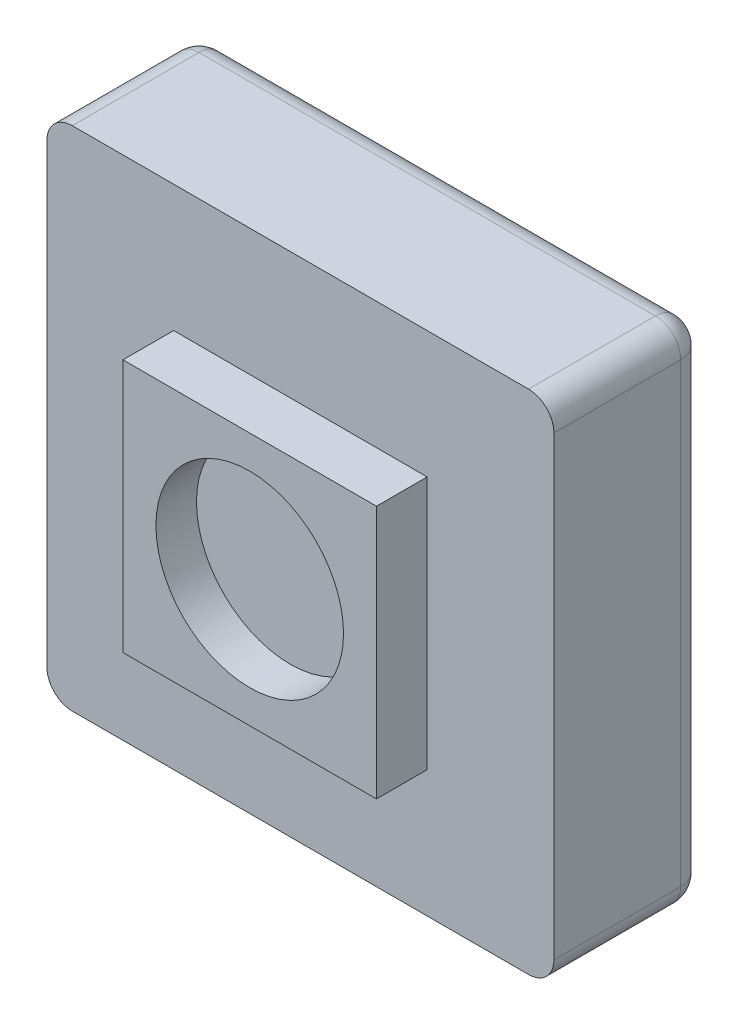
ISO-10303-21;
HEADER;
FILE_DESCRIPTION(('STEP AP214'),'2;1');
FILE_NAME('part.step','',(''),(''),'','','');
FILE_SCHEMA(('AUTOMOTIVE_DESIGN { 1 0 10303 214 1 1 1 1 }'));
ENDSEC;
DATA;
#1=APPLICATION_CONTEXT('core data for automotive mechanical design processes');
#2=APPLICATION_PROTOCOL_DEFINITION('international standard','automotive_design',2000,#1);
#3=PRODUCT_CONTEXT('',#1,'mechanical');
#4=PRODUCT('Part','Part','',(#3));
#5=PRODUCT_RELATED_PRODUCT_CATEGORY('part','',(#4));
#6=PRODUCT_DEFINITION_FORMATION('','',#4);
#7=PRODUCT_DEFINITION_CONTEXT('part definition',#1,'design');
#8=PRODUCT_DEFINITION('design','',#6,#7);
#9=PRODUCT_DEFINITION_SHAPE('','',#8);
#10=(LENGTH_UNIT() NAMED_UNIT(*) SI_UNIT(.MILLI.,.METRE.));
#11=(NAMED_UNIT(*) PLANE_ANGLE_UNIT() SI_UNIT($,.RADIAN.));
#12=(NAMED_UNIT(*) SI_UNIT($,.STERADIAN.) SOLID_ANGLE_UNIT());
#13=UNCERTAINTY_MEASURE_WITH_UNIT(LENGTH_MEASURE(1.E-05),#10,'distance_accuracy_value','');
#14=(GEOMETRIC_REPRESENTATION_CONTEXT(3) GLOBAL_UNCERTAINTY_ASSIGNED_CONTEXT((#13)) GLOBAL_UNIT_ASSIGNED_CONTEXT((#10,
#11,#12)) REPRESENTATION_CONTEXT('',''));
#15=CARTESIAN_POINT('',(0.,0.,0.));
#16=DIRECTION('',(0.,0.,1.));
#17=DIRECTION('',(1.,0.,0.));
#18=AXIS2_PLACEMENT_3D('',#15,#16,#17);
#19=CARTESIAN_POINT('',(4.99999999999998,5.00000000000002,3.));
#20=DIRECTION('',(-1.,0.,0.));
#21=DIRECTION('',(0.,-1.,0.));
#22=AXIS2_PLACEMENT_3D('',#19,#20,#21);
#23=PLANE('',#22);
#24=DIRECTION('',(0.,0.,-1.));
#25=VECTOR('',#24,1.);
#26=CARTESIAN_POINT('',(4.99999999999998,-4.49999999999999,3.));
#27=LINE('',#26,#25);
#28=CARTESIAN_POINT('',(4.99999999999998,-4.49999999999999,3.));
#29=VERTEX_POINT('',#28);
#30=CARTESIAN_POINT('',(4.99999999999998,-4.49999999999999,0.5));
#31=VERTEX_POINT('',#30);
#32=EDGE_CURVE('E226',#29,#31,#27,.T.);
#33=ORIENTED_EDGE('',*,*,#32,.T.);
#34=DIRECTION('',(0.,1.,0.));
#35=VECTOR('',#34,1.);
#36=CARTESIAN_POINT('',(4.99999999999998,5.00000000000002,0.5));
#37=LINE('',#36,#35);
#38=CARTESIAN_POINT('',(4.99999999999998,4.50000000000002,0.5));
#39=VERTEX_POINT('',#38);
#40=EDGE_CURVE('E237',#31,#39,#37,.T.);
#41=ORIENTED_EDGE('',*,*,#40,.T.);
#42=DIRECTION('',(0.,0.,-1.));
#43=VECTOR('',#42,1.);
#44=CARTESIAN_POINT('',(4.99999999999998,4.50000000000002,3.));
#45=LINE('',#44,#43);
#46=CARTESIAN_POINT('',(4.99999999999998,4.50000000000002,3.));
#47=VERTEX_POINT('',#46);
#48=EDGE_CURVE('E230',#39,#47,#45,.F.);
#49=ORIENTED_EDGE('',*,*,#48,.T.);
#50=DIRECTION('',(0.,1.,0.));
#51=VECTOR('',#50,1.);
#52=CARTESIAN_POINT('',(4.99999999999998,5.00000000000002,3.));
#53=LINE('',#52,#51);
#54=EDGE_CURVE('E173',#29,#47,#53,.T.);
#55=ORIENTED_EDGE('',*,*,#54,.F.);
#56=EDGE_LOOP('',(#33,#41,#49,#55));
#57=FACE_BOUND('',#56,.T.);
#58=ADVANCED_FACE('F41',(#57),#23,.F.);
#59=CARTESIAN_POINT('',(-5.00000000000002,5.00000000000002,3.));
#60=DIRECTION('',(0.,-1.,0.));
#61=DIRECTION('',(0.,0.,-1.));
#62=AXIS2_PLACEMENT_3D('',#59,#60,#61);
#63=PLANE('',#62);
#64=DIRECTION('',(0.,0.,-1.));
#65=VECTOR('',#64,1.);
#66=CARTESIAN_POINT('',(4.49999999999998,5.00000000000002,3.));
#67=LINE('',#66,#65);
#68=CARTESIAN_POINT('',(4.49999999999998,5.00000000000002,3.));
#69=VERTEX_POINT('',#68);
#70=CARTESIAN_POINT('',(4.49999999999998,5.00000000000002,0.5));
#71=VERTEX_POINT('',#70);
#72=EDGE_CURVE('E219',#69,#71,#67,.T.);
#73=ORIENTED_EDGE('',*,*,#72,.T.);
#74=DIRECTION('',(-1.,0.,0.));
#75=VECTOR('',#74,1.);
#76=CARTESIAN_POINT('',(-5.00000000000002,5.00000000000002,0.5));
#77=LINE('',#76,#75);
#78=CARTESIAN_POINT('',(-4.50000000000002,5.00000000000002,0.5));
#79=VERTEX_POINT('',#78);
#80=EDGE_CURVE('E256',#71,#79,#77,.T.);
#81=ORIENTED_EDGE('',*,*,#80,.T.);
#82=DIRECTION('',(0.,0.,-1.));
#83=VECTOR('',#82,1.);
#84=CARTESIAN_POINT('',(-4.50000000000002,5.00000000000002,3.));
#85=LINE('',#84,#83);
#86=CARTESIAN_POINT('',(-4.50000000000002,5.00000000000002,3.));
#87=VERTEX_POINT('',#86);
#88=EDGE_CURVE('E223',#79,#87,#85,.F.);
#89=ORIENTED_EDGE('',*,*,#88,.T.);
#90=DIRECTION('',(-1.,0.,0.));
#91=VECTOR('',#90,1.);
#92=CARTESIAN_POINT('',(-5.00000000000002,5.00000000000002,3.));
#93=LINE('',#92,#91);
#94=EDGE_CURVE('E178',#69,#87,#93,.T.);
#95=ORIENTED_EDGE('',*,*,#94,.F.);
#96=EDGE_LOOP('',(#73,#81,#89,#95));
#97=FACE_BOUND('',#96,.T.);
#98=ADVANCED_FACE('F382',(#97),#63,.F.);
#99=CARTESIAN_POINT('',(-5.00000000000002,5.00000000000002,3.));
#100=DIRECTION('',(1.,0.,0.));
#101=DIRECTION('',(0.,1.,0.));
#102=AXIS2_PLACEMENT_3D('',#99,#100,#101);
#103=PLANE('',#102);
#104=DIRECTION('',(0.,0.,-1.));
#105=VECTOR('',#104,1.);
#106=CARTESIAN_POINT('',(-5.00000000000002,4.50000000000002,3.));
#107=LINE('',#106,#105);
#108=CARTESIAN_POINT('',(-5.00000000000002,4.50000000000002,3.));
#109=VERTEX_POINT('',#108);
#110=CARTESIAN_POINT('',(-5.00000000000002,4.50000000000002,0.5));
#111=VERTEX_POINT('',#110);
#112=EDGE_CURVE('E201',#109,#111,#107,.T.);
#113=ORIENTED_EDGE('',*,*,#112,.T.);
#114=DIRECTION('',(0.,-1.,0.));
#115=VECTOR('',#114,1.);
#116=CARTESIAN_POINT('',(-5.00000000000002,5.00000000000002,0.5));
#117=LINE('',#116,#115);
#118=CARTESIAN_POINT('',(-5.00000000000002,-4.49999999999999,0.5));
#119=VERTEX_POINT('',#118);
#120=EDGE_CURVE('E66',#111,#119,#117,.T.);
#121=ORIENTED_EDGE('',*,*,#120,.T.);
#122=DIRECTION('',(0.,0.,-1.));
#123=VECTOR('',#122,1.);
#124=CARTESIAN_POINT('',(-5.00000000000002,-4.49999999999999,3.));
#125=LINE('',#124,#123);
#126=CARTESIAN_POINT('',(-5.00000000000002,-4.49999999999999,3.));
#127=VERTEX_POINT('',#126);
#128=EDGE_CURVE('E204',#119,#127,#125,.F.);
#129=ORIENTED_EDGE('',*,*,#128,.T.);
#130=DIRECTION('',(0.,-1.,0.));
#131=VECTOR('',#130,1.);
#132=CARTESIAN_POINT('',(-5.00000000000002,5.00000000000002,3.));
#133=LINE('',#132,#131);
#134=EDGE_CURVE('E187',#109,#127,#133,.T.);
#135=ORIENTED_EDGE('',*,*,#134,.F.);
#136=EDGE_LOOP('',(#113,#121,#129,#135));
#137=FACE_BOUND('',#136,.T.);
#138=ADVANCED_FACE('F402',(#137),#103,.F.);
#139=CARTESIAN_POINT('',(-5.00000000000002,-4.99999999999999,3.));
#140=DIRECTION('',(0.,1.,0.));
#141=DIRECTION('',(0.,0.,1.));
#142=AXIS2_PLACEMENT_3D('',#139,#140,#141);
#143=PLANE('',#142);
#144=DIRECTION('',(0.,0.,-1.));
#145=VECTOR('',#144,1.);
#146=CARTESIAN_POINT('',(-4.50000000000002,-4.99999999999999,3.));
#147=LINE('',#146,#145);
#148=CARTESIAN_POINT('',(-4.50000000000002,-4.99999999999999,3.));
#149=VERTEX_POINT('',#148);
#150=CARTESIAN_POINT('',(-4.50000000000002,-4.99999999999999,0.5));
#151=VERTEX_POINT('',#150);
#152=EDGE_CURVE('E198',#149,#151,#147,.T.);
#153=ORIENTED_EDGE('',*,*,#152,.T.);
#154=DIRECTION('',(1.,0.,0.));
#155=VECTOR('',#154,1.);
#156=CARTESIAN_POINT('',(-5.00000000000002,-4.99999999999999,0.5));
#157=LINE('',#156,#155);
#158=CARTESIAN_POINT('',(4.49999999999998,-4.99999999999999,0.5));
#159=VERTEX_POINT('',#158);
#160=EDGE_CURVE('E11',#151,#159,#157,.T.);
#161=ORIENTED_EDGE('',*,*,#160,.T.);
#162=DIRECTION('',(0.,0.,-1.));
#163=VECTOR('',#162,1.);
#164=CARTESIAN_POINT('',(4.49999999999998,-4.99999999999999,3.));
#165=LINE('',#164,#163);
#166=CARTESIAN_POINT('',(4.49999999999998,-4.99999999999999,3.));
#167=VERTEX_POINT('',#166);
#168=EDGE_CURVE('E195',#159,#167,#165,.F.);
#169=ORIENTED_EDGE('',*,*,#168,.T.);
#170=DIRECTION('',(1.,0.,0.));
#171=VECTOR('',#170,1.);
#172=CARTESIAN_POINT('',(-5.00000000000002,-4.99999999999999,3.));
#173=LINE('',#172,#171);
#174=EDGE_CURVE('E191',#149,#167,#173,.T.);
#175=ORIENTED_EDGE('',*,*,#174,.F.);
#176=EDGE_LOOP('',(#153,#161,#169,#175));
#177=FACE_BOUND('',#176,.T.);
#178=ADVANCED_FACE('F340',(#177),#143,.F.);
#179=CARTESIAN_POINT('',(0.,0.,3.));
#180=DIRECTION('',(0.,0.,1.));
#181=DIRECTION('',(1.,0.,0.));
#182=AXIS2_PLACEMENT_3D('',#179,#180,#181);
#183=PLANE('',#182);
#184=DIRECTION('',(0.,1.,0.));
#185=VECTOR('',#184,1.);
#186=CARTESIAN_POINT('',(2.5,2.5,3.));
#187=LINE('',#186,#185);
#188=CARTESIAN_POINT('',(2.5,-2.5,3.));
#189=VERTEX_POINT('',#188);
#190=CARTESIAN_POINT('',(2.5,2.5,3.));
#191=VERTEX_POINT('',#190);
#192=EDGE_CURVE('E171',#189,#191,#187,.T.);
#193=ORIENTED_EDGE('',*,*,#192,.F.);
#194=DIRECTION('',(1.,0.,0.));
#195=VECTOR('',#194,1.);
#196=CARTESIAN_POINT('',(-2.5,-2.5,3.));
#197=LINE('',#196,#195);
#198=CARTESIAN_POINT('',(-2.5,-2.5,3.));
#199=VERTEX_POINT('',#198);
#200=EDGE_CURVE('E168',#199,#189,#197,.T.);
#201=ORIENTED_EDGE('',*,*,#200,.F.);
#202=DIRECTION('',(0.,-1.,0.));
#203=VECTOR('',#202,1.);
#204=CARTESIAN_POINT('',(-2.5,2.5,3.));
#205=LINE('',#204,#203);
#206=CARTESIAN_POINT('',(-2.5,2.5,3.));
#207=VERTEX_POINT('',#206);
#208=EDGE_CURVE('E320',#207,#199,#205,.T.);
#209=ORIENTED_EDGE('',*,*,#208,.F.);
#210=DIRECTION('',(-1.,0.,0.));
#211=VECTOR('',#210,1.);
#212=CARTESIAN_POINT('',(-2.5,2.5,3.));
#213=LINE('',#212,#211);
#214=EDGE_CURVE('E317',#191,#207,#213,.T.);
#215=ORIENTED_EDGE('',*,*,#214,.F.);
#216=EDGE_LOOP('',(#193,#201,#209,#215));
#217=FACE_BOUND('',#216,.T.);
#218=ORIENTED_EDGE('',*,*,#134,.T.);
#219=CARTESIAN_POINT('',(-4.50000000000002,-4.49999999999999,3.));
#220=DIRECTION('',(0.,0.,1.));
#221=DIRECTION('',(1.,0.,0.));
#222=AXIS2_PLACEMENT_3D('',#219,#220,#221);
#223=CIRCLE('',#222,0.5);
#224=EDGE_CURVE('E216',#127,#149,#223,.T.);
#225=ORIENTED_EDGE('',*,*,#224,.T.);
#226=ORIENTED_EDGE('',*,*,#174,.T.);
#227=CARTESIAN_POINT('',(4.49999999999998,-4.49999999999999,3.));
#228=DIRECTION('',(0.,0.,1.));
#229=DIRECTION('',(1.,0.,0.));
#230=AXIS2_PLACEMENT_3D('',#227,#228,#229);
#231=CIRCLE('',#230,0.5);
#232=EDGE_CURVE('E207',#167,#29,#231,.T.);
#233=ORIENTED_EDGE('',*,*,#232,.T.);
#234=ORIENTED_EDGE('',*,*,#54,.T.);
#235=CARTESIAN_POINT('',(4.49999999999998,4.50000000000002,3.));
#236=DIRECTION('',(0.,0.,1.));
#237=DIRECTION('',(1.,0.,0.));
#238=AXIS2_PLACEMENT_3D('',#235,#236,#237);
#239=CIRCLE('',#238,0.5);
#240=EDGE_CURVE('E210',#47,#69,#239,.T.);
#241=ORIENTED_EDGE('',*,*,#240,.T.);
#242=ORIENTED_EDGE('',*,*,#94,.T.);
#243=CARTESIAN_POINT('',(-4.50000000000002,4.50000000000002,3.));
#244=DIRECTION('',(0.,0.,1.));
#245=DIRECTION('',(1.,0.,0.));
#246=AXIS2_PLACEMENT_3D('',#243,#244,#245);
#247=CIRCLE('',#246,0.5);
#248=EDGE_CURVE('E213',#87,#109,#247,.T.);
#249=ORIENTED_EDGE('',*,*,#248,.T.);
#250=EDGE_LOOP('',(#218,#225,#226,#233,#234,#241,#242,#249));
#251=FACE_BOUND('',#250,.T.);
#252=ADVANCED_FACE('F336',(#217,#251),#183,.T.);
#253=CARTESIAN_POINT('',(0.,0.,0.));
#254=DIRECTION('',(0.,0.,1.));
#255=DIRECTION('',(1.,0.,0.));
#256=AXIS2_PLACEMENT_3D('',#253,#254,#255);
#257=PLANE('',#256);
#258=DIRECTION('',(-1.,0.,0.));
#259=VECTOR('',#258,1.);
#260=CARTESIAN_POINT('',(0.,4.50000000000002,0.));
#261=LINE('',#260,#259);
#262=CARTESIAN_POINT('',(-4.50000000000002,4.50000000000002,0.));
#263=VERTEX_POINT('',#262);
#264=CARTESIAN_POINT('',(4.49999999999998,4.50000000000002,0.));
#265=VERTEX_POINT('',#264);
#266=EDGE_CURVE('E246',#263,#265,#261,.F.);
#267=ORIENTED_EDGE('',*,*,#266,.T.);
#268=DIRECTION('',(0.,1.,0.));
#269=VECTOR('',#268,1.);
#270=CARTESIAN_POINT('',(4.49999999999998,0.,0.));
#271=LINE('',#270,#269);
#272=CARTESIAN_POINT('',(4.49999999999998,-4.49999999999999,0.));
#273=VERTEX_POINT('',#272);
#274=EDGE_CURVE('E249',#265,#273,#271,.F.);
#275=ORIENTED_EDGE('',*,*,#274,.T.);
#276=DIRECTION('',(1.,0.,0.));
#277=VECTOR('',#276,1.);
#278=CARTESIAN_POINT('',(0.,-4.49999999999999,0.));
#279=LINE('',#278,#277);
#280=CARTESIAN_POINT('',(-4.50000000000002,-4.49999999999999,0.));
#281=VERTEX_POINT('',#280);
#282=EDGE_CURVE('E240',#273,#281,#279,.F.);
#283=ORIENTED_EDGE('',*,*,#282,.T.);
#284=DIRECTION('',(0.,-1.,0.));
#285=VECTOR('',#284,1.);
#286=CARTESIAN_POINT('',(-4.50000000000002,0.,0.));
#287=LINE('',#286,#285);
#288=EDGE_CURVE('E243',#281,#263,#287,.F.);
#289=ORIENTED_EDGE('',*,*,#288,.T.);
#290=EDGE_LOOP('',(#267,#275,#283,#289));
#291=FACE_BOUND('',#290,.T.);
#292=ADVANCED_FACE('F339',(#291),#257,.F.);
#293=CARTESIAN_POINT('',(2.5,2.5,4.));
#294=DIRECTION('',(-1.,0.,0.));
#295=DIRECTION('',(0.,-1.,0.));
#296=AXIS2_PLACEMENT_3D('',#293,#294,#295);
#297=PLANE('',#296);
#298=ORIENTED_EDGE('',*,*,#192,.T.);
#299=DIRECTION('',(0.,0.,-1.));
#300=VECTOR('',#299,1.);
#301=CARTESIAN_POINT('',(2.5,2.5,4.));
#302=LINE('',#301,#300);
#303=CARTESIAN_POINT('',(2.5,2.5,4.));
#304=VERTEX_POINT('',#303);
#305=EDGE_CURVE('E150',#304,#191,#302,.T.);
#306=ORIENTED_EDGE('',*,*,#305,.F.);
#307=DIRECTION('',(0.,1.,0.));
#308=VECTOR('',#307,1.);
#309=CARTESIAN_POINT('',(2.5,2.5,4.));
#310=LINE('',#309,#308);
#311=CARTESIAN_POINT('',(2.5,-2.5,4.));
#312=VERTEX_POINT('',#311);
#313=EDGE_CURVE('E158',#312,#304,#310,.T.);
#314=ORIENTED_EDGE('',*,*,#313,.F.);
#315=DIRECTION('',(0.,0.,-1.));
#316=VECTOR('',#315,1.);
#317=CARTESIAN_POINT('',(2.5,-2.5,4.));
#318=LINE('',#317,#316);
#319=EDGE_CURVE('E314',#312,#189,#318,.T.);
#320=ORIENTED_EDGE('',*,*,#319,.T.);
#321=EDGE_LOOP('',(#298,#306,#314,#320));
#322=FACE_BOUND('',#321,.T.);
#323=ADVANCED_FACE('F170',(#322),#297,.F.);
#324=CARTESIAN_POINT('',(-2.5,2.5,4.));
#325=DIRECTION('',(0.,-1.,0.));
#326=DIRECTION('',(0.,0.,-1.));
#327=AXIS2_PLACEMENT_3D('',#324,#325,#326);
#328=PLANE('',#327);
#329=ORIENTED_EDGE('',*,*,#214,.T.);
#330=DIRECTION('',(0.,0.,-1.));
#331=VECTOR('',#330,1.);
#332=CARTESIAN_POINT('',(-2.5,2.5,4.));
#333=LINE('',#332,#331);
#334=CARTESIAN_POINT('',(-2.5,2.5,4.));
#335=VERTEX_POINT('',#334);
#336=EDGE_CURVE('E153',#335,#207,#333,.T.);
#337=ORIENTED_EDGE('',*,*,#336,.F.);
#338=DIRECTION('',(-1.,0.,0.));
#339=VECTOR('',#338,1.);
#340=CARTESIAN_POINT('',(-2.5,2.5,4.));
#341=LINE('',#340,#339);
#342=EDGE_CURVE('E145',#304,#335,#341,.T.);
#343=ORIENTED_EDGE('',*,*,#342,.F.);
#344=ORIENTED_EDGE('',*,*,#305,.T.);
#345=EDGE_LOOP('',(#329,#337,#343,#344));
#346=FACE_BOUND('',#345,.T.);
#347=ADVANCED_FACE('F148',(#346),#328,.F.);
#348=CARTESIAN_POINT('',(-2.5,2.5,4.));
#349=DIRECTION('',(1.,0.,0.));
#350=DIRECTION('',(0.,1.,0.));
#351=AXIS2_PLACEMENT_3D('',#348,#349,#350);
#352=PLANE('',#351);
#353=ORIENTED_EDGE('',*,*,#208,.T.);
#354=DIRECTION('',(0.,0.,-1.));
#355=VECTOR('',#354,1.);
#356=CARTESIAN_POINT('',(-2.5,-2.5,4.));
#357=LINE('',#356,#355);
#358=CARTESIAN_POINT('',(-2.5,-2.5,4.));
#359=VERTEX_POINT('',#358);
#360=EDGE_CURVE('E180',#359,#199,#357,.T.);
#361=ORIENTED_EDGE('',*,*,#360,.F.);
#362=DIRECTION('',(0.,-1.,0.));
#363=VECTOR('',#362,1.);
#364=CARTESIAN_POINT('',(-2.5,2.5,4.));
#365=LINE('',#364,#363);
#366=EDGE_CURVE('E157',#335,#359,#365,.T.);
#367=ORIENTED_EDGE('',*,*,#366,.F.);
#368=ORIENTED_EDGE('',*,*,#336,.T.);
#369=EDGE_LOOP('',(#353,#361,#367,#368));
#370=FACE_BOUND('',#369,.T.);
#371=ADVANCED_FACE('F334',(#370),#352,.F.);
#372=CARTESIAN_POINT('',(-2.5,-2.5,4.));
#373=DIRECTION('',(0.,1.,0.));
#374=DIRECTION('',(0.,0.,1.));
#375=AXIS2_PLACEMENT_3D('',#372,#373,#374);
#376=PLANE('',#375);
#377=ORIENTED_EDGE('',*,*,#200,.T.);
#378=ORIENTED_EDGE('',*,*,#319,.F.);
#379=DIRECTION('',(1.,0.,0.));
#380=VECTOR('',#379,1.);
#381=CARTESIAN_POINT('',(-2.5,-2.5,4.));
#382=LINE('',#381,#380);
#383=EDGE_CURVE('E163',#359,#312,#382,.T.);
#384=ORIENTED_EDGE('',*,*,#383,.F.);
#385=ORIENTED_EDGE('',*,*,#360,.T.);
#386=EDGE_LOOP('',(#377,#378,#384,#385));
#387=FACE_BOUND('',#386,.T.);
#388=ADVANCED_FACE('F332',(#387),#376,.F.);
#389=CARTESIAN_POINT('',(0.,0.,4.));
#390=DIRECTION('',(0.,0.,1.));
#391=DIRECTION('',(1.,0.,0.));
#392=AXIS2_PLACEMENT_3D('',#389,#390,#391);
#393=PLANE('',#392);
#394=CARTESIAN_POINT('',(0.,0.,4.));
#395=DIRECTION('',(0.,0.,1.));
#396=DIRECTION('',(1.,0.,0.));
#397=AXIS2_PLACEMENT_3D('',#394,#395,#396);
#398=CIRCLE('',#397,1.85);
#399=CARTESIAN_POINT('',(1.85,0.,4.));
#400=VERTEX_POINT('',#399);
#401=EDGE_CURVE('E296',#400,#400,#398,.T.);
#402=ORIENTED_EDGE('',*,*,#401,.F.);
#403=EDGE_LOOP('',(#402));
#404=FACE_BOUND('',#403,.T.);
#405=ORIENTED_EDGE('',*,*,#313,.T.);
#406=ORIENTED_EDGE('',*,*,#342,.T.);
#407=ORIENTED_EDGE('',*,*,#366,.T.);
#408=ORIENTED_EDGE('',*,*,#383,.T.);
#409=EDGE_LOOP('',(#405,#406,#407,#408));
#410=FACE_BOUND('',#409,.T.);
#411=ADVANCED_FACE('F161',(#404,#410),#393,.T.);
#412=CARTESIAN_POINT('',(0.,0.,3.2));
#413=DIRECTION('',(0.,0.,1.));
#414=DIRECTION('',(1.,0.,0.));
#415=AXIS2_PLACEMENT_3D('',#412,#413,#414);
#416=CYLINDRICAL_SURFACE('',#415,1.85);
#417=CARTESIAN_POINT('',(0.,0.,3.2));
#418=DIRECTION('',(0.,0.,1.));
#419=DIRECTION('',(1.,0.,0.));
#420=AXIS2_PLACEMENT_3D('',#417,#418,#419);
#421=CIRCLE('',#420,1.85);
#422=CARTESIAN_POINT('',(1.85,0.,3.2));
#423=VERTEX_POINT('',#422);
#424=EDGE_CURVE('E302',#423,#423,#421,.T.);
#425=ORIENTED_EDGE('',*,*,#424,.F.);
#426=EDGE_LOOP('',(#425));
#427=FACE_BOUND('',#426,.T.);
#428=ORIENTED_EDGE('',*,*,#401,.T.);
#429=EDGE_LOOP('',(#428));
#430=FACE_BOUND('',#429,.T.);
#431=ADVANCED_FACE('F503',(#427,#430),#416,.F.);
#432=CARTESIAN_POINT('',(0.,0.,3.2));
#433=DIRECTION('',(0.,0.,1.));
#434=DIRECTION('',(1.,0.,0.));
#435=AXIS2_PLACEMENT_3D('',#432,#433,#434);
#436=PLANE('',#435);
#437=ORIENTED_EDGE('',*,*,#424,.T.);
#438=EDGE_LOOP('',(#437));
#439=FACE_BOUND('',#438,.T.);
#440=ADVANCED_FACE('F409',(#439),#436,.T.);
#441=CARTESIAN_POINT('',(-4.50000000000002,-4.49999999999999,3.));
#442=DIRECTION('',(0.,0.,-1.));
#443=DIRECTION('',(-1.,0.,0.));
#444=AXIS2_PLACEMENT_3D('',#441,#442,#443);
#445=CYLINDRICAL_SURFACE('',#444,0.5);
#446=ORIENTED_EDGE('',*,*,#128,.F.);
#447=CARTESIAN_POINT('',(-4.50000000000002,-4.49999999999999,0.5));
#448=DIRECTION('',(0.,0.,-1.));
#449=DIRECTION('',(-1.,0.,0.));
#450=AXIS2_PLACEMENT_3D('',#447,#448,#449);
#451=CIRCLE('',#450,0.5);
#452=EDGE_CURVE('E51',#119,#151,#451,.F.);
#453=ORIENTED_EDGE('',*,*,#452,.T.);
#454=ORIENTED_EDGE('',*,*,#152,.F.);
#455=ORIENTED_EDGE('',*,*,#224,.F.);
#456=EDGE_LOOP('',(#446,#453,#454,#455));
#457=FACE_BOUND('',#456,.T.);
#458=ADVANCED_FACE('F347',(#457),#445,.T.);
#459=CARTESIAN_POINT('',(-4.50000000000002,4.50000000000002,3.));
#460=DIRECTION('',(0.,0.,-1.));
#461=DIRECTION('',(-1.,0.,0.));
#462=AXIS2_PLACEMENT_3D('',#459,#460,#461);
#463=CYLINDRICAL_SURFACE('',#462,0.5);
#464=ORIENTED_EDGE('',*,*,#88,.F.);
#465=CARTESIAN_POINT('',(-4.50000000000002,4.50000000000002,0.5));
#466=DIRECTION('',(0.,0.,-1.));
#467=DIRECTION('',(-1.,0.,0.));
#468=AXIS2_PLACEMENT_3D('',#465,#466,#467);
#469=CIRCLE('',#468,0.5);
#470=EDGE_CURVE('E259',#79,#111,#469,.F.);
#471=ORIENTED_EDGE('',*,*,#470,.T.);
#472=ORIENTED_EDGE('',*,*,#112,.F.);
#473=ORIENTED_EDGE('',*,*,#248,.F.);
#474=EDGE_LOOP('',(#464,#471,#472,#473));
#475=FACE_BOUND('',#474,.T.);
#476=ADVANCED_FACE('F408',(#475),#463,.T.);
#477=CARTESIAN_POINT('',(4.49999999999998,4.50000000000002,3.));
#478=DIRECTION('',(0.,0.,-1.));
#479=DIRECTION('',(-1.,0.,0.));
#480=AXIS2_PLACEMENT_3D('',#477,#478,#479);
#481=CYLINDRICAL_SURFACE('',#480,0.5);
#482=ORIENTED_EDGE('',*,*,#48,.F.);
#483=CARTESIAN_POINT('',(4.49999999999998,4.50000000000002,0.5));
#484=DIRECTION('',(0.,0.,-1.));
#485=DIRECTION('',(-1.,0.,0.));
#486=AXIS2_PLACEMENT_3D('',#483,#484,#485);
#487=CIRCLE('',#486,0.5);
#488=EDGE_CURVE('E253',#39,#71,#487,.F.);
#489=ORIENTED_EDGE('',*,*,#488,.T.);
#490=ORIENTED_EDGE('',*,*,#72,.F.);
#491=ORIENTED_EDGE('',*,*,#240,.F.);
#492=EDGE_LOOP('',(#482,#489,#490,#491));
#493=FACE_BOUND('',#492,.T.);
#494=ADVANCED_FACE('F379',(#493),#481,.T.);
#495=CARTESIAN_POINT('',(4.49999999999998,-4.49999999999999,3.));
#496=DIRECTION('',(0.,0.,-1.));
#497=DIRECTION('',(-1.,0.,0.));
#498=AXIS2_PLACEMENT_3D('',#495,#496,#497);
#499=CYLINDRICAL_SURFACE('',#498,0.5);
#500=ORIENTED_EDGE('',*,*,#168,.F.);
#501=CARTESIAN_POINT('',(4.49999999999998,-4.49999999999999,0.5));
#502=DIRECTION('',(0.,0.,-1.));
#503=DIRECTION('',(-1.,0.,0.));
#504=AXIS2_PLACEMENT_3D('',#501,#502,#503);
#505=CIRCLE('',#504,0.5);
#506=EDGE_CURVE('E233',#159,#31,#505,.F.);
#507=ORIENTED_EDGE('',*,*,#506,.T.);
#508=ORIENTED_EDGE('',*,*,#32,.F.);
#509=ORIENTED_EDGE('',*,*,#232,.F.);
#510=EDGE_LOOP('',(#500,#507,#508,#509));
#511=FACE_BOUND('',#510,.T.);
#512=ADVANCED_FACE('F372',(#511),#499,.T.);
#513=CARTESIAN_POINT('',(-4.50000000000002,4.50000000000002,0.5));
#514=DIRECTION('',(0.,0.,1.));
#515=DIRECTION('',(1.,0.,0.));
#516=AXIS2_PLACEMENT_3D('',#513,#514,#515);
#517=SPHERICAL_SURFACE('',#516,0.5);
#518=CARTESIAN_POINT('',(-4.50000000000002,4.50000000000002,0.5));
#519=DIRECTION('',(0.,-1.,0.));
#520=DIRECTION('',(0.,0.,-1.));
#521=AXIS2_PLACEMENT_3D('',#518,#519,#520);
#522=CIRCLE('',#521,0.5);
#523=EDGE_CURVE('E287',#111,#263,#522,.T.);
#524=ORIENTED_EDGE('',*,*,#523,.F.);
#525=ORIENTED_EDGE('',*,*,#470,.F.);
#526=CARTESIAN_POINT('',(-4.50000000000002,4.50000000000002,0.5));
#527=DIRECTION('',(1.,0.,0.));
#528=DIRECTION('',(0.,0.,-1.));
#529=AXIS2_PLACEMENT_3D('',#526,#527,#528);
#530=CIRCLE('',#529,0.5);
#531=EDGE_CURVE('E45',#263,#79,#530,.T.);
#532=ORIENTED_EDGE('',*,*,#531,.F.);
#533=EDGE_LOOP('',(#524,#525,#532));
#534=FACE_BOUND('',#533,.T.);
#535=ADVANCED_FACE('F43',(#534),#517,.T.);
#536=CARTESIAN_POINT('',(-5.00000000000002,4.50000000000002,0.5));
#537=DIRECTION('',(-1.,0.,0.));
#538=DIRECTION('',(0.,0.,1.));
#539=AXIS2_PLACEMENT_3D('',#536,#537,#538);
#540=CYLINDRICAL_SURFACE('',#539,0.5);
#541=ORIENTED_EDGE('',*,*,#531,.T.);
#542=ORIENTED_EDGE('',*,*,#80,.F.);
#543=CARTESIAN_POINT('',(4.49999999999998,4.50000000000002,0.5));
#544=DIRECTION('',(1.,0.,0.));
#545=DIRECTION('',(0.,0.,-1.));
#546=AXIS2_PLACEMENT_3D('',#543,#544,#545);
#547=CIRCLE('',#546,0.5);
#548=EDGE_CURVE('E284',#265,#71,#547,.T.);
#549=ORIENTED_EDGE('',*,*,#548,.F.);
#550=ORIENTED_EDGE('',*,*,#266,.F.);
#551=EDGE_LOOP('',(#541,#542,#549,#550));
#552=FACE_BOUND('',#551,.T.);
#553=ADVANCED_FACE('F385',(#552),#540,.T.);
#554=CARTESIAN_POINT('',(-4.50000000000002,5.00000000000002,0.5));
#555=DIRECTION('',(0.,-1.,0.));
#556=DIRECTION('',(1.,0.,0.));
#557=AXIS2_PLACEMENT_3D('',#554,#555,#556);
#558=CYLINDRICAL_SURFACE('',#557,0.5);
#559=ORIENTED_EDGE('',*,*,#523,.T.);
#560=ORIENTED_EDGE('',*,*,#288,.F.);
#561=CARTESIAN_POINT('',(-4.50000000000002,-4.49999999999999,0.5));
#562=DIRECTION('',(0.,-1.,0.));
#563=DIRECTION('',(0.,0.,-1.));
#564=AXIS2_PLACEMENT_3D('',#561,#562,#563);
#565=CIRCLE('',#564,0.5);
#566=EDGE_CURVE('E280',#119,#281,#565,.T.);
#567=ORIENTED_EDGE('',*,*,#566,.F.);
#568=ORIENTED_EDGE('',*,*,#120,.F.);
#569=EDGE_LOOP('',(#559,#560,#567,#568));
#570=FACE_BOUND('',#569,.T.);
#571=ADVANCED_FACE('F389',(#570),#558,.T.);
#572=CARTESIAN_POINT('',(4.49999999999998,4.50000000000002,0.5));
#573=DIRECTION('',(0.,0.,1.));
#574=DIRECTION('',(1.,0.,0.));
#575=AXIS2_PLACEMENT_3D('',#572,#573,#574);
#576=SPHERICAL_SURFACE('',#575,0.5);
#577=ORIENTED_EDGE('',*,*,#548,.T.);
#578=ORIENTED_EDGE('',*,*,#488,.F.);
#579=CARTESIAN_POINT('',(4.49999999999998,4.50000000000002,0.5));
#580=DIRECTION('',(0.,-1.,0.));
#581=DIRECTION('',(0.,0.,-1.));
#582=AXIS2_PLACEMENT_3D('',#579,#580,#581);
#583=CIRCLE('',#582,0.5);
#584=EDGE_CURVE('E276',#265,#39,#583,.T.);
#585=ORIENTED_EDGE('',*,*,#584,.F.);
#586=EDGE_LOOP('',(#577,#578,#585));
#587=FACE_BOUND('',#586,.T.);
#588=ADVANCED_FACE('F387',(#587),#576,.T.);
#589=CARTESIAN_POINT('',(-4.50000000000002,-4.49999999999999,0.5));
#590=DIRECTION('',(0.,0.,1.));
#591=DIRECTION('',(1.,0.,0.));
#592=AXIS2_PLACEMENT_3D('',#589,#590,#591);
#593=SPHERICAL_SURFACE('',#592,0.5);
#594=ORIENTED_EDGE('',*,*,#452,.F.);
#595=ORIENTED_EDGE('',*,*,#566,.T.);
#596=CARTESIAN_POINT('',(-4.50000000000002,-4.49999999999999,0.5));
#597=DIRECTION('',(1.,0.,0.));
#598=DIRECTION('',(0.,0.,-1.));
#599=AXIS2_PLACEMENT_3D('',#596,#597,#598);
#600=CIRCLE('',#599,0.5);
#601=EDGE_CURVE('E272',#151,#281,#600,.T.);
#602=ORIENTED_EDGE('',*,*,#601,.F.);
#603=EDGE_LOOP('',(#594,#595,#602));
#604=FACE_BOUND('',#603,.T.);
#605=ADVANCED_FACE('F354',(#604),#593,.T.);
#606=CARTESIAN_POINT('',(4.49999999999998,5.00000000000002,0.5));
#607=DIRECTION('',(0.,1.,0.));
#608=DIRECTION('',(-1.,0.,0.));
#609=AXIS2_PLACEMENT_3D('',#606,#607,#608);
#610=CYLINDRICAL_SURFACE('',#609,0.5);
#611=ORIENTED_EDGE('',*,*,#584,.T.);
#612=ORIENTED_EDGE('',*,*,#40,.F.);
#613=CARTESIAN_POINT('',(4.49999999999998,-4.49999999999999,0.5));
#614=DIRECTION('',(0.,-1.,0.));
#615=DIRECTION('',(0.,0.,-1.));
#616=AXIS2_PLACEMENT_3D('',#613,#614,#615);
#617=CIRCLE('',#616,0.5);
#618=EDGE_CURVE('E269',#273,#31,#617,.T.);
#619=ORIENTED_EDGE('',*,*,#618,.F.);
#620=ORIENTED_EDGE('',*,*,#274,.F.);
#621=EDGE_LOOP('',(#611,#612,#619,#620));
#622=FACE_BOUND('',#621,.T.);
#623=ADVANCED_FACE('F366',(#622),#610,.T.);
#624=CARTESIAN_POINT('',(-5.00000000000002,-4.49999999999999,0.5));
#625=DIRECTION('',(1.,0.,0.));
#626=DIRECTION('',(0.,0.,-1.));
#627=AXIS2_PLACEMENT_3D('',#624,#625,#626);
#628=CYLINDRICAL_SURFACE('',#627,0.5);
#629=ORIENTED_EDGE('',*,*,#601,.T.);
#630=ORIENTED_EDGE('',*,*,#282,.F.);
#631=CARTESIAN_POINT('',(4.49999999999998,-4.49999999999999,0.5));
#632=DIRECTION('',(1.,0.,0.));
#633=DIRECTION('',(0.,0.,-1.));
#634=AXIS2_PLACEMENT_3D('',#631,#632,#633);
#635=CIRCLE('',#634,0.5);
#636=EDGE_CURVE('E266',#159,#273,#635,.T.);
#637=ORIENTED_EDGE('',*,*,#636,.F.);
#638=ORIENTED_EDGE('',*,*,#160,.F.);
#639=EDGE_LOOP('',(#629,#630,#637,#638));
#640=FACE_BOUND('',#639,.T.);
#641=ADVANCED_FACE('F358',(#640),#628,.T.);
#642=CARTESIAN_POINT('',(4.49999999999998,-4.49999999999999,0.5));
#643=DIRECTION('',(0.,0.,1.));
#644=DIRECTION('',(1.,0.,0.));
#645=AXIS2_PLACEMENT_3D('',#642,#643,#644);
#646=SPHERICAL_SURFACE('',#645,0.5);
#647=ORIENTED_EDGE('',*,*,#618,.T.);
#648=ORIENTED_EDGE('',*,*,#506,.F.);
#649=ORIENTED_EDGE('',*,*,#636,.T.);
#650=EDGE_LOOP('',(#647,#648,#649));
#651=FACE_BOUND('',#650,.T.);
#652=ADVANCED_FACE('F362',(#651),#646,.T.);
#653=CLOSED_SHELL('',(#58,#98,#138,#178,#252,#292,#323,#347,#371,#388,#411,#431,#440,#458,#476,
#494,#512,#535,#553,#571,#588,#605,#623,#641,#652));
#654=MANIFOLD_SOLID_BREP('B2',#653);
#655=ADVANCED_BREP_SHAPE_REPRESENTATION('',(#18,#654),#14);
#656=SHAPE_DEFINITION_REPRESENTATION(#9,#655);
ENDSEC;
END-ISO-10303-21;
